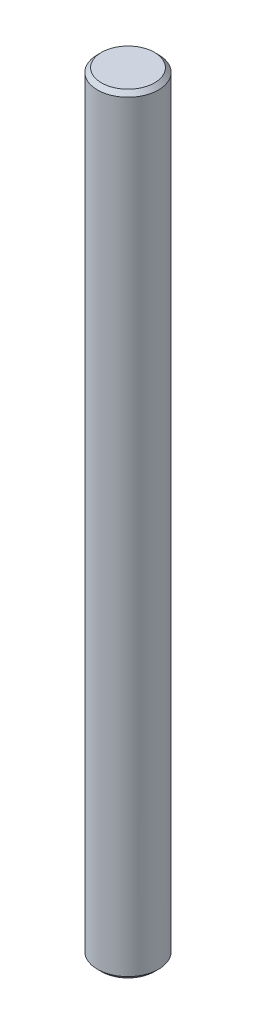
ISO-10303-21;
HEADER;
FILE_DESCRIPTION(('STEP AP214'),'2;1');
FILE_NAME('part.step','',(''),(''),'','','');
FILE_SCHEMA(('AUTOMOTIVE_DESIGN { 1 0 10303 214 1 1 1 1 }'));
ENDSEC;
DATA;
#1=APPLICATION_CONTEXT('core data for automotive mechanical design processes');
#2=APPLICATION_PROTOCOL_DEFINITION('international standard','automotive_design',2000,#1);
#3=PRODUCT_CONTEXT('',#1,'mechanical');
#4=PRODUCT('Part','Part','',(#3));
#5=PRODUCT_RELATED_PRODUCT_CATEGORY('part','',(#4));
#6=PRODUCT_DEFINITION_FORMATION('','',#4);
#7=PRODUCT_DEFINITION_CONTEXT('part definition',#1,'design');
#8=PRODUCT_DEFINITION('design','',#6,#7);
#9=PRODUCT_DEFINITION_SHAPE('','',#8);
#10=(LENGTH_UNIT() NAMED_UNIT(*) SI_UNIT(.MILLI.,.METRE.));
#11=(NAMED_UNIT(*) PLANE_ANGLE_UNIT() SI_UNIT($,.RADIAN.));
#12=(NAMED_UNIT(*) SI_UNIT($,.STERADIAN.) SOLID_ANGLE_UNIT());
#13=UNCERTAINTY_MEASURE_WITH_UNIT(LENGTH_MEASURE(1.E-05),#10,'distance_accuracy_value','');
#14=(GEOMETRIC_REPRESENTATION_CONTEXT(3) GLOBAL_UNCERTAINTY_ASSIGNED_CONTEXT((#13)) GLOBAL_UNIT_ASSIGNED_CONTEXT((#10,
#11,#12)) REPRESENTATION_CONTEXT('',''));
#15=CARTESIAN_POINT('',(0.,0.,0.));
#16=DIRECTION('',(0.,0.,1.));
#17=DIRECTION('',(1.,0.,0.));
#18=AXIS2_PLACEMENT_3D('',#15,#16,#17);
#19=CARTESIAN_POINT('',(7.49999999999998,189.,0.));
#20=DIRECTION('',(0.,-1.,0.));
#21=DIRECTION('',(1.,0.,0.));
#22=AXIS2_PLACEMENT_3D('',#19,#20,#21);
#23=PLANE('',#22);
#24=CARTESIAN_POINT('',(0.,189.,0.));
#25=DIRECTION('',(0.,-1.,0.));
#26=DIRECTION('',(1.,0.,0.));
#27=AXIS2_PLACEMENT_3D('',#24,#25,#26);
#28=CIRCLE('',#27,6.50000000000001);
#29=CARTESIAN_POINT('',(6.50000000000001,189.,0.));
#30=VERTEX_POINT('',#29);
#31=EDGE_CURVE('E11',#30,#30,#28,.F.);
#32=ORIENTED_EDGE('',*,*,#31,.T.);
#33=EDGE_LOOP('',(#32));
#34=FACE_BOUND('',#33,.T.);
#35=ADVANCED_FACE('F35',(#34),#23,.F.);
#36=CARTESIAN_POINT('',(0.,189.,0.));
#37=DIRECTION('',(0.,1.,0.));
#38=DIRECTION('',(-1.,0.,0.));
#39=AXIS2_PLACEMENT_3D('',#36,#37,#38);
#40=CYLINDRICAL_SURFACE('',#39,7.49999999999999);
#41=CARTESIAN_POINT('',(0.,1.,0.));
#42=DIRECTION('',(0.,1.,0.));
#43=DIRECTION('',(-1.,0.,0.));
#44=AXIS2_PLACEMENT_3D('',#41,#42,#43);
#45=CIRCLE('',#44,7.49999999999999);
#46=CARTESIAN_POINT('',(-7.49999999999999,1.,0.));
#47=VERTEX_POINT('',#46);
#48=EDGE_CURVE('E173',#47,#47,#45,.T.);
#49=ORIENTED_EDGE('',*,*,#48,.T.);
#50=EDGE_LOOP('',(#49));
#51=FACE_BOUND('',#50,.T.);
#52=CARTESIAN_POINT('',(0.,188.,0.));
#53=DIRECTION('',(0.,-1.,0.));
#54=DIRECTION('',(1.,0.,0.));
#55=AXIS2_PLACEMENT_3D('',#52,#53,#54);
#56=CIRCLE('',#55,7.49999999999999);
#57=CARTESIAN_POINT('',(7.49999999999999,188.,0.));
#58=VERTEX_POINT('',#57);
#59=EDGE_CURVE('E170',#58,#58,#56,.T.);
#60=ORIENTED_EDGE('',*,*,#59,.T.);
#61=EDGE_LOOP('',(#60));
#62=FACE_BOUND('',#61,.T.);
#63=DIRECTION('',(0.,1.,0.));
#64=VECTOR('',#63,1.);
#65=CARTESIAN_POINT('',(-1.5,189.,-7.34846922834952));
#66=LINE('',#65,#64);
#67=CARTESIAN_POINT('',(-1.5,89.,-7.34846922834952));
#68=VERTEX_POINT('',#67);
#69=CARTESIAN_POINT('',(-1.5,104.,-7.34846922834952));
#70=VERTEX_POINT('',#69);
#71=EDGE_CURVE('E166',#68,#70,#66,.T.);
#72=ORIENTED_EDGE('',*,*,#71,.F.);
#73=CARTESIAN_POINT('',(0.,89.,0.));
#74=DIRECTION('',(0.,-1.,0.));
#75=DIRECTION('',(0.,0.,-1.));
#76=AXIS2_PLACEMENT_3D('',#73,#74,#75);
#77=CIRCLE('',#76,7.49999999999999);
#78=CARTESIAN_POINT('',(1.5,89.,-7.34846922834952));
#79=VERTEX_POINT('',#78);
#80=EDGE_CURVE('E168',#68,#79,#77,.T.);
#81=ORIENTED_EDGE('',*,*,#80,.T.);
#82=DIRECTION('',(0.,1.,0.));
#83=VECTOR('',#82,1.);
#84=CARTESIAN_POINT('',(1.5,189.,-7.34846922834952));
#85=LINE('',#84,#83);
#86=CARTESIAN_POINT('',(1.5,104.,-7.34846922834952));
#87=VERTEX_POINT('',#86);
#88=EDGE_CURVE('E107',#87,#79,#85,.F.);
#89=ORIENTED_EDGE('',*,*,#88,.F.);
#90=CARTESIAN_POINT('',(0.,104.,0.));
#91=DIRECTION('',(0.,-1.,0.));
#92=DIRECTION('',(0.,0.,-1.));
#93=AXIS2_PLACEMENT_3D('',#90,#91,#92);
#94=CIRCLE('',#93,7.49999999999999);
#95=EDGE_CURVE('E163',#70,#87,#94,.T.);
#96=ORIENTED_EDGE('',*,*,#95,.F.);
#97=EDGE_LOOP('',(#72,#81,#89,#96));
#98=FACE_BOUND('',#97,.T.);
#99=DIRECTION('',(0.,1.,0.));
#100=VECTOR('',#99,1.);
#101=CARTESIAN_POINT('',(-1.5,189.,-7.34846922834952));
#102=LINE('',#101,#100);
#103=CARTESIAN_POINT('',(-1.5,169.,-7.34846922834952));
#104=VERTEX_POINT('',#103);
#105=CARTESIAN_POINT('',(-1.5,151.,-7.34846922834952));
#106=VERTEX_POINT('',#105);
#107=EDGE_CURVE('E157',#104,#106,#102,.F.);
#108=ORIENTED_EDGE('',*,*,#107,.T.);
#109=CARTESIAN_POINT('',(0.,151.,0.));
#110=DIRECTION('',(0.,-1.,0.));
#111=DIRECTION('',(0.,0.,-1.));
#112=AXIS2_PLACEMENT_3D('',#109,#110,#111);
#113=CIRCLE('',#112,7.49999999999999);
#114=CARTESIAN_POINT('',(1.5,151.,-7.34846922834952));
#115=VERTEX_POINT('',#114);
#116=EDGE_CURVE('E160',#106,#115,#113,.T.);
#117=ORIENTED_EDGE('',*,*,#116,.T.);
#118=DIRECTION('',(0.,1.,0.));
#119=VECTOR('',#118,1.);
#120=CARTESIAN_POINT('',(1.5,189.,-7.34846922834952));
#121=LINE('',#120,#119);
#122=CARTESIAN_POINT('',(1.5,169.,-7.34846922834952));
#123=VERTEX_POINT('',#122);
#124=EDGE_CURVE('E154',#115,#123,#121,.T.);
#125=ORIENTED_EDGE('',*,*,#124,.T.);
#126=CARTESIAN_POINT('',(0.,169.,0.));
#127=DIRECTION('',(0.,-1.,0.));
#128=DIRECTION('',(0.,0.,-1.));
#129=AXIS2_PLACEMENT_3D('',#126,#127,#128);
#130=CIRCLE('',#129,7.49999999999999);
#131=EDGE_CURVE('E150',#104,#123,#130,.T.);
#132=ORIENTED_EDGE('',*,*,#131,.F.);
#133=EDGE_LOOP('',(#108,#117,#125,#132));
#134=FACE_BOUND('',#133,.T.);
#135=ADVANCED_FACE('F185',(#51,#62,#98,#134),#40,.T.);
#136=CARTESIAN_POINT('',(7.5,0.,0.));
#137=DIRECTION('',(0.,1.,0.));
#138=DIRECTION('',(-1.,0.,0.));
#139=AXIS2_PLACEMENT_3D('',#136,#137,#138);
#140=PLANE('',#139);
#141=CARTESIAN_POINT('',(0.,0.,0.));
#142=DIRECTION('',(0.,1.,0.));
#143=DIRECTION('',(-1.,0.,0.));
#144=AXIS2_PLACEMENT_3D('',#141,#142,#143);
#145=CIRCLE('',#144,6.49999999999998);
#146=CARTESIAN_POINT('',(-6.49999999999998,0.,0.));
#147=VERTEX_POINT('',#146);
#148=EDGE_CURVE('E43',#147,#147,#145,.F.);
#149=ORIENTED_EDGE('',*,*,#148,.T.);
#150=EDGE_LOOP('',(#149));
#151=FACE_BOUND('',#150,.T.);
#152=ADVANCED_FACE('F178',(#151),#140,.F.);
#153=CARTESIAN_POINT('',(-1.5,151.,-8.99999999999997));
#154=DIRECTION('',(-1.,0.,0.));
#155=DIRECTION('',(0.,0.,1.));
#156=AXIS2_PLACEMENT_3D('',#153,#154,#155);
#157=PLANE('',#156);
#158=DIRECTION('',(0.,0.,1.));
#159=VECTOR('',#158,1.);
#160=CARTESIAN_POINT('',(-1.5,169.,-8.99999999999997));
#161=LINE('',#160,#159);
#162=CARTESIAN_POINT('',(-1.5,169.,-5.99999999999997));
#163=VERTEX_POINT('',#162);
#164=EDGE_CURVE('E58',#104,#163,#161,.T.);
#165=ORIENTED_EDGE('',*,*,#164,.T.);
#166=DIRECTION('',(0.,1.,0.));
#167=VECTOR('',#166,1.);
#168=CARTESIAN_POINT('',(-1.5,151.,-5.99999999999997));
#169=LINE('',#168,#167);
#170=CARTESIAN_POINT('',(-1.5,151.,-5.99999999999997));
#171=VERTEX_POINT('',#170);
#172=EDGE_CURVE('E141',#171,#163,#169,.T.);
#173=ORIENTED_EDGE('',*,*,#172,.F.);
#174=DIRECTION('',(0.,0.,1.));
#175=VECTOR('',#174,1.);
#176=CARTESIAN_POINT('',(-1.5,151.,-8.99999999999997));
#177=LINE('',#176,#175);
#178=EDGE_CURVE('E132',#106,#171,#177,.T.);
#179=ORIENTED_EDGE('',*,*,#178,.F.);
#180=ORIENTED_EDGE('',*,*,#107,.F.);
#181=EDGE_LOOP('',(#165,#173,#179,#180));
#182=FACE_BOUND('',#181,.T.);
#183=ADVANCED_FACE('F197',(#182),#157,.F.);
#184=CARTESIAN_POINT('',(1.5,151.,-8.99999999999997));
#185=DIRECTION('',(1.,0.,0.));
#186=DIRECTION('',(0.,1.,0.));
#187=AXIS2_PLACEMENT_3D('',#184,#185,#186);
#188=PLANE('',#187);
#189=DIRECTION('',(0.,0.,-1.));
#190=VECTOR('',#189,1.);
#191=CARTESIAN_POINT('',(1.5,151.,-8.99999999999997));
#192=LINE('',#191,#190);
#193=CARTESIAN_POINT('',(1.5,151.,-5.99999999999997));
#194=VERTEX_POINT('',#193);
#195=EDGE_CURVE('E138',#194,#115,#192,.T.);
#196=ORIENTED_EDGE('',*,*,#195,.F.);
#197=DIRECTION('',(0.,1.,0.));
#198=VECTOR('',#197,1.);
#199=CARTESIAN_POINT('',(1.5,151.,-5.99999999999997));
#200=LINE('',#199,#198);
#201=CARTESIAN_POINT('',(1.5,169.,-5.99999999999997));
#202=VERTEX_POINT('',#201);
#203=EDGE_CURVE('E148',#194,#202,#200,.T.);
#204=ORIENTED_EDGE('',*,*,#203,.T.);
#205=DIRECTION('',(0.,0.,-1.));
#206=VECTOR('',#205,1.);
#207=CARTESIAN_POINT('',(1.5,169.,-8.99999999999997));
#208=LINE('',#207,#206);
#209=EDGE_CURVE('E135',#202,#123,#208,.T.);
#210=ORIENTED_EDGE('',*,*,#209,.T.);
#211=ORIENTED_EDGE('',*,*,#124,.F.);
#212=EDGE_LOOP('',(#196,#204,#210,#211));
#213=FACE_BOUND('',#212,.T.);
#214=ADVANCED_FACE('F204',(#213),#188,.F.);
#215=CARTESIAN_POINT('',(0.,151.,0.));
#216=DIRECTION('',(0.,-1.,0.));
#217=DIRECTION('',(0.,0.,-1.));
#218=AXIS2_PLACEMENT_3D('',#215,#216,#217);
#219=PLANE('',#218);
#220=ORIENTED_EDGE('',*,*,#178,.T.);
#221=DIRECTION('',(1.,0.,0.));
#222=VECTOR('',#221,1.);
#223=CARTESIAN_POINT('',(1.5,151.,-5.99999999999997));
#224=LINE('',#223,#222);
#225=EDGE_CURVE('E134',#171,#194,#224,.T.);
#226=ORIENTED_EDGE('',*,*,#225,.T.);
#227=ORIENTED_EDGE('',*,*,#195,.T.);
#228=ORIENTED_EDGE('',*,*,#116,.F.);
#229=EDGE_LOOP('',(#220,#226,#227,#228));
#230=FACE_BOUND('',#229,.T.);
#231=ADVANCED_FACE('F201',(#230),#219,.F.);
#232=CARTESIAN_POINT('',(0.,169.,0.));
#233=DIRECTION('',(0.,-1.,0.));
#234=DIRECTION('',(0.,0.,-1.));
#235=AXIS2_PLACEMENT_3D('',#232,#233,#234);
#236=PLANE('',#235);
#237=ORIENTED_EDGE('',*,*,#131,.T.);
#238=ORIENTED_EDGE('',*,*,#209,.F.);
#239=DIRECTION('',(1.,0.,0.));
#240=VECTOR('',#239,1.);
#241=CARTESIAN_POINT('',(1.5,169.,-5.99999999999997));
#242=LINE('',#241,#240);
#243=EDGE_CURVE('E143',#163,#202,#242,.T.);
#244=ORIENTED_EDGE('',*,*,#243,.F.);
#245=ORIENTED_EDGE('',*,*,#164,.F.);
#246=EDGE_LOOP('',(#237,#238,#244,#245));
#247=FACE_BOUND('',#246,.T.);
#248=ADVANCED_FACE('F206',(#247),#236,.T.);
#249=CARTESIAN_POINT('',(1.5,151.,-5.99999999999997));
#250=DIRECTION('',(0.,0.,1.));
#251=DIRECTION('',(1.,0.,0.));
#252=AXIS2_PLACEMENT_3D('',#249,#250,#251);
#253=PLANE('',#252);
#254=ORIENTED_EDGE('',*,*,#243,.T.);
#255=ORIENTED_EDGE('',*,*,#203,.F.);
#256=ORIENTED_EDGE('',*,*,#225,.F.);
#257=ORIENTED_EDGE('',*,*,#172,.T.);
#258=EDGE_LOOP('',(#254,#255,#256,#257));
#259=FACE_BOUND('',#258,.T.);
#260=ADVANCED_FACE('F208',(#259),#253,.F.);
#261=CARTESIAN_POINT('',(-1.5,89.,-9.));
#262=DIRECTION('',(1.,0.,0.));
#263=DIRECTION('',(0.,0.,-1.));
#264=AXIS2_PLACEMENT_3D('',#261,#262,#263);
#265=PLANE('',#264);
#266=ORIENTED_EDGE('',*,*,#71,.T.);
#267=DIRECTION('',(0.,0.,-1.));
#268=VECTOR('',#267,1.);
#269=CARTESIAN_POINT('',(-1.5,104.,-9.));
#270=LINE('',#269,#268);
#271=CARTESIAN_POINT('',(-1.5,104.,-6.));
#272=VERTEX_POINT('',#271);
#273=EDGE_CURVE('E50',#272,#70,#270,.T.);
#274=ORIENTED_EDGE('',*,*,#273,.F.);
#275=DIRECTION('',(0.,1.,0.));
#276=VECTOR('',#275,1.);
#277=CARTESIAN_POINT('',(-1.5,89.,-6.));
#278=LINE('',#277,#276);
#279=CARTESIAN_POINT('',(-1.5,89.,-6.));
#280=VERTEX_POINT('',#279);
#281=EDGE_CURVE('E119',#280,#272,#278,.T.);
#282=ORIENTED_EDGE('',*,*,#281,.F.);
#283=DIRECTION('',(0.,0.,-1.));
#284=VECTOR('',#283,1.);
#285=CARTESIAN_POINT('',(-1.5,89.,-9.));
#286=LINE('',#285,#284);
#287=EDGE_CURVE('E112',#280,#68,#286,.T.);
#288=ORIENTED_EDGE('',*,*,#287,.T.);
#289=EDGE_LOOP('',(#266,#274,#282,#288));
#290=FACE_BOUND('',#289,.T.);
#291=ADVANCED_FACE('F210',(#290),#265,.T.);
#292=CARTESIAN_POINT('',(1.5,89.,-9.));
#293=DIRECTION('',(-1.,0.,0.));
#294=DIRECTION('',(0.,0.,1.));
#295=AXIS2_PLACEMENT_3D('',#292,#293,#294);
#296=PLANE('',#295);
#297=ORIENTED_EDGE('',*,*,#88,.T.);
#298=DIRECTION('',(0.,0.,1.));
#299=VECTOR('',#298,1.);
#300=CARTESIAN_POINT('',(1.5,89.,-9.));
#301=LINE('',#300,#299);
#302=CARTESIAN_POINT('',(1.5,89.,-6.));
#303=VERTEX_POINT('',#302);
#304=EDGE_CURVE('E100',#79,#303,#301,.T.);
#305=ORIENTED_EDGE('',*,*,#304,.T.);
#306=DIRECTION('',(0.,1.,0.));
#307=VECTOR('',#306,1.);
#308=CARTESIAN_POINT('',(1.5,89.,-6.));
#309=LINE('',#308,#307);
#310=CARTESIAN_POINT('',(1.5,104.,-6.));
#311=VERTEX_POINT('',#310);
#312=EDGE_CURVE('E104',#303,#311,#309,.T.);
#313=ORIENTED_EDGE('',*,*,#312,.T.);
#314=DIRECTION('',(0.,0.,1.));
#315=VECTOR('',#314,1.);
#316=CARTESIAN_POINT('',(1.5,104.,-9.));
#317=LINE('',#316,#315);
#318=EDGE_CURVE('E129',#87,#311,#317,.T.);
#319=ORIENTED_EDGE('',*,*,#318,.F.);
#320=EDGE_LOOP('',(#297,#305,#313,#319));
#321=FACE_BOUND('',#320,.T.);
#322=ADVANCED_FACE('F102',(#321),#296,.T.);
#323=CARTESIAN_POINT('',(0.,89.,0.));
#324=DIRECTION('',(0.,-1.,0.));
#325=DIRECTION('',(0.,0.,-1.));
#326=AXIS2_PLACEMENT_3D('',#323,#324,#325);
#327=PLANE('',#326);
#328=ORIENTED_EDGE('',*,*,#287,.F.);
#329=DIRECTION('',(-1.,0.,0.));
#330=VECTOR('',#329,1.);
#331=CARTESIAN_POINT('',(1.5,89.,-6.));
#332=LINE('',#331,#330);
#333=EDGE_CURVE('E111',#303,#280,#332,.T.);
#334=ORIENTED_EDGE('',*,*,#333,.F.);
#335=ORIENTED_EDGE('',*,*,#304,.F.);
#336=ORIENTED_EDGE('',*,*,#80,.F.);
#337=EDGE_LOOP('',(#328,#334,#335,#336));
#338=FACE_BOUND('',#337,.T.);
#339=ADVANCED_FACE('F122',(#338),#327,.F.);
#340=CARTESIAN_POINT('',(0.,104.,0.));
#341=DIRECTION('',(0.,-1.,0.));
#342=DIRECTION('',(0.,0.,-1.));
#343=AXIS2_PLACEMENT_3D('',#340,#341,#342);
#344=PLANE('',#343);
#345=ORIENTED_EDGE('',*,*,#95,.T.);
#346=ORIENTED_EDGE('',*,*,#318,.T.);
#347=DIRECTION('',(-1.,0.,0.));
#348=VECTOR('',#347,1.);
#349=CARTESIAN_POINT('',(1.5,104.,-6.));
#350=LINE('',#349,#348);
#351=EDGE_CURVE('E118',#311,#272,#350,.T.);
#352=ORIENTED_EDGE('',*,*,#351,.T.);
#353=ORIENTED_EDGE('',*,*,#273,.T.);
#354=EDGE_LOOP('',(#345,#346,#352,#353));
#355=FACE_BOUND('',#354,.T.);
#356=ADVANCED_FACE('F241',(#355),#344,.T.);
#357=CARTESIAN_POINT('',(1.5,89.,-6.));
#358=DIRECTION('',(0.,0.,-1.));
#359=DIRECTION('',(-1.,0.,0.));
#360=AXIS2_PLACEMENT_3D('',#357,#358,#359);
#361=PLANE('',#360);
#362=ORIENTED_EDGE('',*,*,#351,.F.);
#363=ORIENTED_EDGE('',*,*,#312,.F.);
#364=ORIENTED_EDGE('',*,*,#333,.T.);
#365=ORIENTED_EDGE('',*,*,#281,.T.);
#366=EDGE_LOOP('',(#362,#363,#364,#365));
#367=FACE_BOUND('',#366,.T.);
#368=ADVANCED_FACE('F115',(#367),#361,.T.);
#369=CARTESIAN_POINT('',(0.,1.,0.));
#370=DIRECTION('',(0.,1.,0.));
#371=DIRECTION('',(-1.,0.,0.));
#372=AXIS2_PLACEMENT_3D('',#369,#370,#371);
#373=CONICAL_SURFACE('',#372,7.49999999999999,0.785398163397453);
#374=ORIENTED_EDGE('',*,*,#148,.F.);
#375=EDGE_LOOP('',(#374));
#376=FACE_BOUND('',#375,.T.);
#377=ORIENTED_EDGE('',*,*,#48,.F.);
#378=EDGE_LOOP('',(#377));
#379=FACE_BOUND('',#378,.T.);
#380=ADVANCED_FACE('F180',(#376,#379),#373,.T.);
#381=CARTESIAN_POINT('',(0.,189.,0.));
#382=DIRECTION('',(0.,-1.,0.));
#383=DIRECTION('',(1.,0.,0.));
#384=AXIS2_PLACEMENT_3D('',#381,#382,#383);
#385=CONICAL_SURFACE('',#384,6.50000000000001,0.785398163397453);
#386=ORIENTED_EDGE('',*,*,#59,.F.);
#387=EDGE_LOOP('',(#386));
#388=FACE_BOUND('',#387,.T.);
#389=ORIENTED_EDGE('',*,*,#31,.F.);
#390=EDGE_LOOP('',(#389));
#391=FACE_BOUND('',#390,.T.);
#392=ADVANCED_FACE('F37',(#388,#391),#385,.T.);
#393=CLOSED_SHELL('',(#35,#135,#152,#183,#214,#231,#248,#260,#291,#322,#339,#356,#368,#380,#392));
#394=MANIFOLD_SOLID_BREP('B2',#393);
#395=ADVANCED_BREP_SHAPE_REPRESENTATION('',(#18,#394),#14);
#396=SHAPE_DEFINITION_REPRESENTATION(#9,#395);
ENDSEC;
END-ISO-10303-21;
